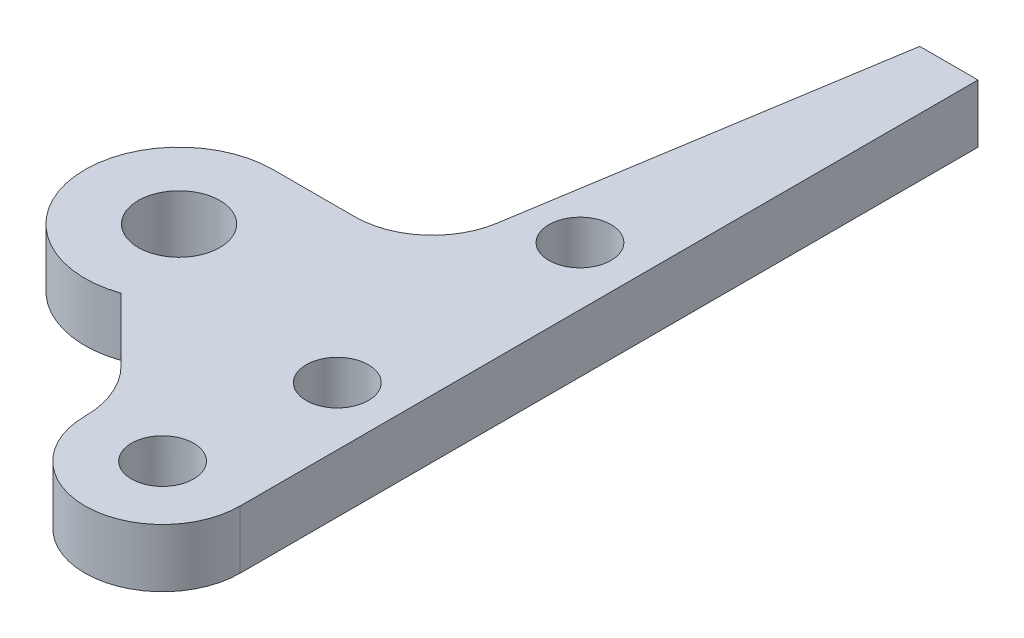
ISO-10303-21;
HEADER;
FILE_DESCRIPTION(('STEP AP214'),'2;1');
FILE_NAME('part.step','',(''),(''),'','','');
FILE_SCHEMA(('AUTOMOTIVE_DESIGN { 1 0 10303 214 1 1 1 1 }'));
ENDSEC;
DATA;
#1=APPLICATION_CONTEXT('core data for automotive mechanical design processes');
#2=APPLICATION_PROTOCOL_DEFINITION('international standard','automotive_design',2000,#1);
#3=PRODUCT_CONTEXT('',#1,'mechanical');
#4=PRODUCT('Part','Part','',(#3));
#5=PRODUCT_RELATED_PRODUCT_CATEGORY('part','',(#4));
#6=PRODUCT_DEFINITION_FORMATION('','',#4);
#7=PRODUCT_DEFINITION_CONTEXT('part definition',#1,'design');
#8=PRODUCT_DEFINITION('design','',#6,#7);
#9=PRODUCT_DEFINITION_SHAPE('','',#8);
#10=(LENGTH_UNIT() NAMED_UNIT(*) SI_UNIT(.MILLI.,.METRE.));
#11=(NAMED_UNIT(*) PLANE_ANGLE_UNIT() SI_UNIT($,.RADIAN.));
#12=(NAMED_UNIT(*) SI_UNIT($,.STERADIAN.) SOLID_ANGLE_UNIT());
#13=UNCERTAINTY_MEASURE_WITH_UNIT(LENGTH_MEASURE(1.E-05),#10,'distance_accuracy_value','');
#14=(GEOMETRIC_REPRESENTATION_CONTEXT(3) GLOBAL_UNCERTAINTY_ASSIGNED_CONTEXT((#13)) GLOBAL_UNIT_ASSIGNED_CONTEXT((#10,
#11,#12)) REPRESENTATION_CONTEXT('',''));
#15=CARTESIAN_POINT('',(0.,0.,0.));
#16=DIRECTION('',(0.,0.,1.));
#17=DIRECTION('',(1.,0.,0.));
#18=AXIS2_PLACEMENT_3D('',#15,#16,#17);
#19=CARTESIAN_POINT('',(0.,0.,0.));
#20=DIRECTION('',(0.,1.,0.));
#21=DIRECTION('',(1.,0.,0.));
#22=AXIS2_PLACEMENT_3D('',#19,#20,#21);
#23=PLANE('',#22);
#24=DIRECTION('',(-0.157736652180697,0.,0.98748121428148));
#25=VECTOR('',#24,1.);
#26=CARTESIAN_POINT('',(11.15,0.,-27.));
#27=LINE('',#26,#25);
#28=CARTESIAN_POINT('',(11.15,0.,-27.));
#29=VERTEX_POINT('',#28);
#30=CARTESIAN_POINT('',(8.15,0.,-8.219053391277));
#31=VERTEX_POINT('',#30);
#32=EDGE_CURVE('E111',#29,#31,#27,.T.);
#33=ORIENTED_EDGE('',*,*,#32,.F.);
#34=DIRECTION('',(-1.,0.,0.));
#35=VECTOR('',#34,1.);
#36=CARTESIAN_POINT('',(14.15,0.,-27.));
#37=LINE('',#36,#35);
#38=CARTESIAN_POINT('',(14.15,0.,-27.));
#39=VERTEX_POINT('',#38);
#40=EDGE_CURVE('E36',#39,#29,#37,.T.);
#41=ORIENTED_EDGE('',*,*,#40,.F.);
#42=DIRECTION('',(0.,0.,-1.));
#43=VECTOR('',#42,1.);
#44=CARTESIAN_POINT('',(14.15,0.,11.));
#45=LINE('',#44,#43);
#46=CARTESIAN_POINT('',(14.15,0.,11.));
#47=VERTEX_POINT('',#46);
#48=EDGE_CURVE('E125',#47,#39,#45,.T.);
#49=ORIENTED_EDGE('',*,*,#48,.F.);
#50=CARTESIAN_POINT('',(10.15,0.,11.));
#51=DIRECTION('',(0.,1.,0.));
#52=DIRECTION('',(-1.,0.,0.));
#53=AXIS2_PLACEMENT_3D('',#50,#51,#52);
#54=CIRCLE('',#53,4.);
#55=CARTESIAN_POINT('',(6.15,0.,11.));
#56=VERTEX_POINT('',#55);
#57=EDGE_CURVE('E129',#56,#47,#54,.T.);
#58=ORIENTED_EDGE('',*,*,#57,.F.);
#59=CARTESIAN_POINT('',(1.65,0.,11.));
#60=DIRECTION('',(0.,-1.,0.));
#61=DIRECTION('',(0.707106781186548,0.,-0.707106781186548));
#62=AXIS2_PLACEMENT_3D('',#59,#60,#61);
#63=CIRCLE('',#62,4.5);
#64=CARTESIAN_POINT('',(4.831980515339,0.,7.818019484661));
#65=VERTEX_POINT('',#64);
#66=EDGE_CURVE('E133',#65,#56,#63,.T.);
#67=ORIENTED_EDGE('',*,*,#66,.F.);
#68=DIRECTION('',(0.707106781186548,0.,0.707106781186548));
#69=VECTOR('',#68,1.);
#70=CARTESIAN_POINT('',(1.594397367406,0.,4.580436336727));
#71=LINE('',#70,#69);
#72=CARTESIAN_POINT('',(1.594397367406,0.,4.580436336727));
#73=VERTEX_POINT('',#72);
#74=EDGE_CURVE('E136',#73,#65,#71,.T.);
#75=ORIENTED_EDGE('',*,*,#74,.F.);
#76=CARTESIAN_POINT('',(0.,0.,0.));
#77=DIRECTION('',(0.,1.,0.));
#78=DIRECTION('',(0.,0.,-1.));
#79=AXIS2_PLACEMENT_3D('',#76,#77,#78);
#80=CIRCLE('',#79,4.85);
#81=CARTESIAN_POINT('',(0.,0.,-4.85));
#82=VERTEX_POINT('',#81);
#83=EDGE_CURVE('E139',#82,#73,#80,.T.);
#84=ORIENTED_EDGE('',*,*,#83,.F.);
#85=DIRECTION('',(-1.,0.,0.));
#86=VECTOR('',#85,1.);
#87=CARTESIAN_POINT('',(4.200075142874,0.,-4.85));
#88=LINE('',#87,#86);
#89=CARTESIAN_POINT('',(4.200075142874,0.,-4.85));
#90=VERTEX_POINT('',#89);
#91=EDGE_CURVE('E148',#90,#82,#88,.T.);
#92=ORIENTED_EDGE('',*,*,#91,.F.);
#93=CARTESIAN_POINT('',(4.200075142874,0.,-8.85));
#94=DIRECTION('',(0.,-1.,0.));
#95=DIRECTION('',(0.98748121428148,0.,0.157736652180697));
#96=AXIS2_PLACEMENT_3D('',#93,#94,#95);
#97=CIRCLE('',#96,4.);
#98=EDGE_CURVE('E113',#31,#90,#97,.T.);
#99=ORIENTED_EDGE('',*,*,#98,.F.);
#100=EDGE_LOOP('',(#33,#41,#49,#58,#67,#75,#84,#92,#99));
#101=FACE_BOUND('',#100,.T.);
#102=CARTESIAN_POINT('',(10.15,0.,11.));
#103=DIRECTION('',(0.,-1.,0.));
#104=DIRECTION('',(-1.,0.,0.));
#105=AXIS2_PLACEMENT_3D('',#102,#103,#104);
#106=CIRCLE('',#105,1.6);
#107=CARTESIAN_POINT('',(8.55,0.,11.));
#108=VERTEX_POINT('',#107);
#109=EDGE_CURVE('E27',#108,#108,#106,.T.);
#110=ORIENTED_EDGE('',*,*,#109,.F.);
#111=EDGE_LOOP('',(#110));
#112=FACE_BOUND('',#111,.T.);
#113=CARTESIAN_POINT('',(0.,0.,0.));
#114=DIRECTION('',(0.,1.,0.));
#115=DIRECTION('',(-1.,0.,0.));
#116=AXIS2_PLACEMENT_3D('',#113,#114,#115);
#117=CIRCLE('',#116,2.1);
#118=CARTESIAN_POINT('',(-2.1,0.,0.));
#119=VERTEX_POINT('',#118);
#120=EDGE_CURVE('E11',#119,#119,#117,.T.);
#121=ORIENTED_EDGE('',*,*,#120,.T.);
#122=EDGE_LOOP('',(#121));
#123=FACE_BOUND('',#122,.T.);
#124=CARTESIAN_POINT('',(11.15,0.,3.));
#125=DIRECTION('',(0.,-1.,0.));
#126=DIRECTION('',(-1.,0.,0.));
#127=AXIS2_PLACEMENT_3D('',#124,#125,#126);
#128=CIRCLE('',#127,1.6);
#129=CARTESIAN_POINT('',(9.55,0.,3.));
#130=VERTEX_POINT('',#129);
#131=EDGE_CURVE('E156',#130,#130,#128,.T.);
#132=ORIENTED_EDGE('',*,*,#131,.F.);
#133=EDGE_LOOP('',(#132));
#134=FACE_BOUND('',#133,.T.);
#135=CARTESIAN_POINT('',(11.15,0.,-9.5));
#136=DIRECTION('',(0.,-1.,0.));
#137=DIRECTION('',(-1.,0.,0.));
#138=AXIS2_PLACEMENT_3D('',#135,#136,#137);
#139=CIRCLE('',#138,1.6);
#140=CARTESIAN_POINT('',(9.55,0.,-9.5));
#141=VERTEX_POINT('',#140);
#142=EDGE_CURVE('E159',#141,#141,#139,.T.);
#143=ORIENTED_EDGE('',*,*,#142,.F.);
#144=EDGE_LOOP('',(#143));
#145=FACE_BOUND('',#144,.T.);
#146=ADVANCED_FACE('F17',(#101,#112,#123,#134,#145),#23,.F.);
#147=CARTESIAN_POINT('',(10.15,0.,11.));
#148=DIRECTION('',(0.,1.,0.));
#149=DIRECTION('',(1.,0.,0.));
#150=AXIS2_PLACEMENT_3D('',#147,#148,#149);
#151=CYLINDRICAL_SURFACE('',#150,1.6);
#152=CARTESIAN_POINT('',(10.15,3.,11.));
#153=DIRECTION('',(0.,-1.,0.));
#154=DIRECTION('',(1.,0.,0.));
#155=AXIS2_PLACEMENT_3D('',#152,#153,#154);
#156=CIRCLE('',#155,1.6);
#157=CARTESIAN_POINT('',(11.75,3.,11.));
#158=VERTEX_POINT('',#157);
#159=EDGE_CURVE('E103',#158,#158,#156,.T.);
#160=ORIENTED_EDGE('',*,*,#159,.F.);
#161=EDGE_LOOP('',(#160));
#162=FACE_BOUND('',#161,.T.);
#163=ORIENTED_EDGE('',*,*,#109,.T.);
#164=EDGE_LOOP('',(#163));
#165=FACE_BOUND('',#164,.T.);
#166=ADVANCED_FACE('F199',(#162,#165),#151,.F.);
#167=CARTESIAN_POINT('',(0.,3.,0.));
#168=DIRECTION('',(0.,1.,0.));
#169=DIRECTION('',(1.,0.,0.));
#170=AXIS2_PLACEMENT_3D('',#167,#168,#169);
#171=PLANE('',#170);
#172=DIRECTION('',(-1.,0.,0.));
#173=VECTOR('',#172,1.);
#174=CARTESIAN_POINT('',(4.200075142874,3.,-4.85));
#175=LINE('',#174,#173);
#176=CARTESIAN_POINT('',(4.200075142874,3.,-4.85));
#177=VERTEX_POINT('',#176);
#178=CARTESIAN_POINT('',(0.,3.,-4.85));
#179=VERTEX_POINT('',#178);
#180=EDGE_CURVE('E154',#177,#179,#175,.T.);
#181=ORIENTED_EDGE('',*,*,#180,.T.);
#182=CARTESIAN_POINT('',(0.,3.,0.));
#183=DIRECTION('',(0.,1.,0.));
#184=DIRECTION('',(0.,0.,-1.));
#185=AXIS2_PLACEMENT_3D('',#182,#183,#184);
#186=CIRCLE('',#185,4.85);
#187=CARTESIAN_POINT('',(1.594397367406,3.,4.580436336727));
#188=VERTEX_POINT('',#187);
#189=EDGE_CURVE('E166',#179,#188,#186,.T.);
#190=ORIENTED_EDGE('',*,*,#189,.T.);
#191=DIRECTION('',(0.707106781186548,0.,0.707106781186548));
#192=VECTOR('',#191,1.);
#193=CARTESIAN_POINT('',(1.594397367406,3.,4.580436336727));
#194=LINE('',#193,#192);
#195=CARTESIAN_POINT('',(4.831980515339,3.,7.818019484661));
#196=VERTEX_POINT('',#195);
#197=EDGE_CURVE('E169',#188,#196,#194,.T.);
#198=ORIENTED_EDGE('',*,*,#197,.T.);
#199=CARTESIAN_POINT('',(1.65,3.,11.));
#200=DIRECTION('',(0.,-1.,0.));
#201=DIRECTION('',(0.707106781186548,0.,-0.707106781186548));
#202=AXIS2_PLACEMENT_3D('',#199,#200,#201);
#203=CIRCLE('',#202,4.5);
#204=CARTESIAN_POINT('',(6.15,3.,11.));
#205=VERTEX_POINT('',#204);
#206=EDGE_CURVE('E172',#196,#205,#203,.T.);
#207=ORIENTED_EDGE('',*,*,#206,.T.);
#208=CARTESIAN_POINT('',(10.15,3.,11.));
#209=DIRECTION('',(0.,1.,0.));
#210=DIRECTION('',(-1.,0.,0.));
#211=AXIS2_PLACEMENT_3D('',#208,#209,#210);
#212=CIRCLE('',#211,4.);
#213=CARTESIAN_POINT('',(14.15,3.,11.));
#214=VERTEX_POINT('',#213);
#215=EDGE_CURVE('E175',#205,#214,#212,.T.);
#216=ORIENTED_EDGE('',*,*,#215,.T.);
#217=DIRECTION('',(0.,0.,-1.));
#218=VECTOR('',#217,1.);
#219=CARTESIAN_POINT('',(14.15,3.,11.));
#220=LINE('',#219,#218);
#221=CARTESIAN_POINT('',(14.15,3.,-27.));
#222=VERTEX_POINT('',#221);
#223=EDGE_CURVE('E178',#214,#222,#220,.T.);
#224=ORIENTED_EDGE('',*,*,#223,.T.);
#225=DIRECTION('',(-1.,0.,0.));
#226=VECTOR('',#225,1.);
#227=CARTESIAN_POINT('',(14.15,3.,-27.));
#228=LINE('',#227,#226);
#229=CARTESIAN_POINT('',(11.15,3.,-27.));
#230=VERTEX_POINT('',#229);
#231=EDGE_CURVE('E108',#222,#230,#228,.T.);
#232=ORIENTED_EDGE('',*,*,#231,.T.);
#233=DIRECTION('',(-0.157736652180697,0.,0.98748121428148));
#234=VECTOR('',#233,1.);
#235=CARTESIAN_POINT('',(11.15,3.,-27.));
#236=LINE('',#235,#234);
#237=CARTESIAN_POINT('',(8.15,3.,-8.219053391277));
#238=VERTEX_POINT('',#237);
#239=EDGE_CURVE('E88',#230,#238,#236,.T.);
#240=ORIENTED_EDGE('',*,*,#239,.T.);
#241=CARTESIAN_POINT('',(4.200075142874,3.,-8.85));
#242=DIRECTION('',(0.,-1.,0.));
#243=DIRECTION('',(0.98748121428148,0.,0.157736652180697));
#244=AXIS2_PLACEMENT_3D('',#241,#242,#243);
#245=CIRCLE('',#244,4.);
#246=EDGE_CURVE('E94',#238,#177,#245,.T.);
#247=ORIENTED_EDGE('',*,*,#246,.T.);
#248=EDGE_LOOP('',(#181,#190,#198,#207,#216,#224,#232,#240,#247));
#249=FACE_BOUND('',#248,.T.);
#250=ORIENTED_EDGE('',*,*,#159,.T.);
#251=EDGE_LOOP('',(#250));
#252=FACE_BOUND('',#251,.T.);
#253=CARTESIAN_POINT('',(0.,3.,0.));
#254=DIRECTION('',(0.,1.,0.));
#255=DIRECTION('',(-1.,0.,0.));
#256=AXIS2_PLACEMENT_3D('',#253,#254,#255);
#257=CIRCLE('',#256,2.1);
#258=CARTESIAN_POINT('',(-2.1,3.,0.));
#259=VERTEX_POINT('',#258);
#260=EDGE_CURVE('E151',#259,#259,#257,.T.);
#261=ORIENTED_EDGE('',*,*,#260,.F.);
#262=EDGE_LOOP('',(#261));
#263=FACE_BOUND('',#262,.T.);
#264=CARTESIAN_POINT('',(11.15,3.,3.));
#265=DIRECTION('',(0.,-1.,0.));
#266=DIRECTION('',(-1.,0.,0.));
#267=AXIS2_PLACEMENT_3D('',#264,#265,#266);
#268=CIRCLE('',#267,1.6);
#269=CARTESIAN_POINT('',(9.55,3.,3.));
#270=VERTEX_POINT('',#269);
#271=EDGE_CURVE('E164',#270,#270,#268,.T.);
#272=ORIENTED_EDGE('',*,*,#271,.T.);
#273=EDGE_LOOP('',(#272));
#274=FACE_BOUND('',#273,.T.);
#275=CARTESIAN_POINT('',(11.15,3.,-9.5));
#276=DIRECTION('',(0.,-1.,0.));
#277=DIRECTION('',(-1.,0.,0.));
#278=AXIS2_PLACEMENT_3D('',#275,#276,#277);
#279=CIRCLE('',#278,1.6);
#280=CARTESIAN_POINT('',(9.55,3.,-9.5));
#281=VERTEX_POINT('',#280);
#282=EDGE_CURVE('E184',#281,#281,#279,.T.);
#283=ORIENTED_EDGE('',*,*,#282,.T.);
#284=EDGE_LOOP('',(#283));
#285=FACE_BOUND('',#284,.T.);
#286=ADVANCED_FACE('F105',(#249,#252,#263,#274,#285),#171,.T.);
#287=CARTESIAN_POINT('',(4.200075142874,0.,-8.85));
#288=DIRECTION('',(0.,1.,0.));
#289=DIRECTION('',(1.,0.,0.));
#290=AXIS2_PLACEMENT_3D('',#287,#288,#289);
#291=CYLINDRICAL_SURFACE('',#290,4.);
#292=DIRECTION('',(0.,1.,0.));
#293=VECTOR('',#292,1.);
#294=CARTESIAN_POINT('',(4.200075142874,0.,-4.85));
#295=LINE('',#294,#293);
#296=EDGE_CURVE('E99',#90,#177,#295,.T.);
#297=ORIENTED_EDGE('',*,*,#296,.T.);
#298=ORIENTED_EDGE('',*,*,#246,.F.);
#299=DIRECTION('',(0.,1.,0.));
#300=VECTOR('',#299,1.);
#301=CARTESIAN_POINT('',(8.15,0.,-8.219053391277));
#302=LINE('',#301,#300);
#303=EDGE_CURVE('E97',#31,#238,#302,.T.);
#304=ORIENTED_EDGE('',*,*,#303,.F.);
#305=ORIENTED_EDGE('',*,*,#98,.T.);
#306=EDGE_LOOP('',(#297,#298,#304,#305));
#307=FACE_BOUND('',#306,.T.);
#308=ADVANCED_FACE('F95',(#307),#291,.F.);
#309=CARTESIAN_POINT('',(11.15,0.,-27.));
#310=DIRECTION('',(-0.98748121428148,0.,-0.157736652180697));
#311=DIRECTION('',(-0.157736652180697,0.,0.98748121428148));
#312=AXIS2_PLACEMENT_3D('',#309,#310,#311);
#313=PLANE('',#312);
#314=ORIENTED_EDGE('',*,*,#303,.T.);
#315=ORIENTED_EDGE('',*,*,#239,.F.);
#316=DIRECTION('',(0.,1.,0.));
#317=VECTOR('',#316,1.);
#318=CARTESIAN_POINT('',(11.15,0.,-27.));
#319=LINE('',#318,#317);
#320=EDGE_CURVE('E116',#29,#230,#319,.T.);
#321=ORIENTED_EDGE('',*,*,#320,.F.);
#322=ORIENTED_EDGE('',*,*,#32,.T.);
#323=EDGE_LOOP('',(#314,#315,#321,#322));
#324=FACE_BOUND('',#323,.T.);
#325=ADVANCED_FACE('F110',(#324),#313,.T.);
#326=CARTESIAN_POINT('',(14.15,0.,-27.));
#327=DIRECTION('',(0.,0.,-1.));
#328=DIRECTION('',(-1.,0.,0.));
#329=AXIS2_PLACEMENT_3D('',#326,#327,#328);
#330=PLANE('',#329);
#331=ORIENTED_EDGE('',*,*,#320,.T.);
#332=ORIENTED_EDGE('',*,*,#231,.F.);
#333=DIRECTION('',(0.,1.,0.));
#334=VECTOR('',#333,1.);
#335=CARTESIAN_POINT('',(14.15,0.,-27.));
#336=LINE('',#335,#334);
#337=EDGE_CURVE('E122',#39,#222,#336,.T.);
#338=ORIENTED_EDGE('',*,*,#337,.F.);
#339=ORIENTED_EDGE('',*,*,#40,.T.);
#340=EDGE_LOOP('',(#331,#332,#338,#339));
#341=FACE_BOUND('',#340,.T.);
#342=ADVANCED_FACE('F215',(#341),#330,.T.);
#343=CARTESIAN_POINT('',(14.15,0.,11.));
#344=DIRECTION('',(1.,0.,0.));
#345=DIRECTION('',(0.,0.,-1.));
#346=AXIS2_PLACEMENT_3D('',#343,#344,#345);
#347=PLANE('',#346);
#348=ORIENTED_EDGE('',*,*,#337,.T.);
#349=ORIENTED_EDGE('',*,*,#223,.F.);
#350=DIRECTION('',(0.,1.,0.));
#351=VECTOR('',#350,1.);
#352=CARTESIAN_POINT('',(14.15,0.,11.));
#353=LINE('',#352,#351);
#354=EDGE_CURVE('E126',#47,#214,#353,.T.);
#355=ORIENTED_EDGE('',*,*,#354,.F.);
#356=ORIENTED_EDGE('',*,*,#48,.T.);
#357=EDGE_LOOP('',(#348,#349,#355,#356));
#358=FACE_BOUND('',#357,.T.);
#359=ADVANCED_FACE('F218',(#358),#347,.T.);
#360=CARTESIAN_POINT('',(10.15,0.,11.));
#361=DIRECTION('',(0.,1.,0.));
#362=DIRECTION('',(1.,0.,0.));
#363=AXIS2_PLACEMENT_3D('',#360,#361,#362);
#364=CYLINDRICAL_SURFACE('',#363,4.);
#365=ORIENTED_EDGE('',*,*,#354,.T.);
#366=ORIENTED_EDGE('',*,*,#215,.F.);
#367=DIRECTION('',(0.,1.,0.));
#368=VECTOR('',#367,1.);
#369=CARTESIAN_POINT('',(6.15,0.,11.));
#370=LINE('',#369,#368);
#371=EDGE_CURVE('E130',#56,#205,#370,.T.);
#372=ORIENTED_EDGE('',*,*,#371,.F.);
#373=ORIENTED_EDGE('',*,*,#57,.T.);
#374=EDGE_LOOP('',(#365,#366,#372,#373));
#375=FACE_BOUND('',#374,.T.);
#376=ADVANCED_FACE('F221',(#375),#364,.T.);
#377=CARTESIAN_POINT('',(1.65,0.,11.));
#378=DIRECTION('',(0.,1.,0.));
#379=DIRECTION('',(1.,0.,0.));
#380=AXIS2_PLACEMENT_3D('',#377,#378,#379);
#381=CYLINDRICAL_SURFACE('',#380,4.5);
#382=ORIENTED_EDGE('',*,*,#371,.T.);
#383=ORIENTED_EDGE('',*,*,#206,.F.);
#384=DIRECTION('',(0.,1.,0.));
#385=VECTOR('',#384,1.);
#386=CARTESIAN_POINT('',(4.831980515339,0.,7.818019484661));
#387=LINE('',#386,#385);
#388=EDGE_CURVE('E134',#65,#196,#387,.T.);
#389=ORIENTED_EDGE('',*,*,#388,.F.);
#390=ORIENTED_EDGE('',*,*,#66,.T.);
#391=EDGE_LOOP('',(#382,#383,#389,#390));
#392=FACE_BOUND('',#391,.T.);
#393=ADVANCED_FACE('F225',(#392),#381,.F.);
#394=CARTESIAN_POINT('',(1.594397367406,0.,4.580436336727));
#395=DIRECTION('',(-0.707106781186548,0.,0.707106781186548));
#396=DIRECTION('',(0.707106781186548,0.,0.707106781186548));
#397=AXIS2_PLACEMENT_3D('',#394,#395,#396);
#398=PLANE('',#397);
#399=ORIENTED_EDGE('',*,*,#388,.T.);
#400=ORIENTED_EDGE('',*,*,#197,.F.);
#401=DIRECTION('',(0.,1.,0.));
#402=VECTOR('',#401,1.);
#403=CARTESIAN_POINT('',(1.594397367406,0.,4.580436336727));
#404=LINE('',#403,#402);
#405=EDGE_CURVE('E137',#73,#188,#404,.T.);
#406=ORIENTED_EDGE('',*,*,#405,.F.);
#407=ORIENTED_EDGE('',*,*,#74,.T.);
#408=EDGE_LOOP('',(#399,#400,#406,#407));
#409=FACE_BOUND('',#408,.T.);
#410=ADVANCED_FACE('F229',(#409),#398,.T.);
#411=CARTESIAN_POINT('',(0.,0.,0.));
#412=DIRECTION('',(0.,1.,0.));
#413=DIRECTION('',(1.,0.,0.));
#414=AXIS2_PLACEMENT_3D('',#411,#412,#413);
#415=CYLINDRICAL_SURFACE('',#414,4.85);
#416=ORIENTED_EDGE('',*,*,#405,.T.);
#417=ORIENTED_EDGE('',*,*,#189,.F.);
#418=DIRECTION('',(0.,1.,0.));
#419=VECTOR('',#418,1.);
#420=CARTESIAN_POINT('',(0.,0.,-4.85));
#421=LINE('',#420,#419);
#422=EDGE_CURVE('E21',#82,#179,#421,.T.);
#423=ORIENTED_EDGE('',*,*,#422,.F.);
#424=ORIENTED_EDGE('',*,*,#83,.T.);
#425=EDGE_LOOP('',(#416,#417,#423,#424));
#426=FACE_BOUND('',#425,.T.);
#427=ADVANCED_FACE('F233',(#426),#415,.T.);
#428=CARTESIAN_POINT('',(4.200075142874,0.,-4.85));
#429=DIRECTION('',(0.,0.,-1.));
#430=DIRECTION('',(-1.,0.,0.));
#431=AXIS2_PLACEMENT_3D('',#428,#429,#430);
#432=PLANE('',#431);
#433=ORIENTED_EDGE('',*,*,#422,.T.);
#434=ORIENTED_EDGE('',*,*,#180,.F.);
#435=ORIENTED_EDGE('',*,*,#296,.F.);
#436=ORIENTED_EDGE('',*,*,#91,.T.);
#437=EDGE_LOOP('',(#433,#434,#435,#436));
#438=FACE_BOUND('',#437,.T.);
#439=ADVANCED_FACE('F237',(#438),#432,.T.);
#440=CARTESIAN_POINT('',(0.,-0.4485,0.));
#441=DIRECTION('',(0.,1.,0.));
#442=DIRECTION('',(1.,0.,0.));
#443=AXIS2_PLACEMENT_3D('',#440,#441,#442);
#444=CYLINDRICAL_SURFACE('',#443,2.1);
#445=ORIENTED_EDGE('',*,*,#260,.T.);
#446=EDGE_LOOP('',(#445));
#447=FACE_BOUND('',#446,.T.);
#448=ORIENTED_EDGE('',*,*,#120,.F.);
#449=EDGE_LOOP('',(#448));
#450=FACE_BOUND('',#449,.T.);
#451=ADVANCED_FACE('F196',(#447,#450),#444,.F.);
#452=CARTESIAN_POINT('',(11.15,3.,3.));
#453=DIRECTION('',(0.,-1.,0.));
#454=DIRECTION('',(1.,0.,0.));
#455=AXIS2_PLACEMENT_3D('',#452,#453,#454);
#456=CYLINDRICAL_SURFACE('',#455,1.6);
#457=ORIENTED_EDGE('',*,*,#131,.T.);
#458=EDGE_LOOP('',(#457));
#459=FACE_BOUND('',#458,.T.);
#460=ORIENTED_EDGE('',*,*,#271,.F.);
#461=EDGE_LOOP('',(#460));
#462=FACE_BOUND('',#461,.T.);
#463=ADVANCED_FACE('F190',(#459,#462),#456,.F.);
#464=CARTESIAN_POINT('',(11.15,3.,-9.5));
#465=DIRECTION('',(0.,-1.,0.));
#466=DIRECTION('',(1.,0.,0.));
#467=AXIS2_PLACEMENT_3D('',#464,#465,#466);
#468=CYLINDRICAL_SURFACE('',#467,1.6);
#469=ORIENTED_EDGE('',*,*,#142,.T.);
#470=EDGE_LOOP('',(#469));
#471=FACE_BOUND('',#470,.T.);
#472=ORIENTED_EDGE('',*,*,#282,.F.);
#473=EDGE_LOOP('',(#472));
#474=FACE_BOUND('',#473,.T.);
#475=ADVANCED_FACE('F19',(#471,#474),#468,.F.);
#476=CLOSED_SHELL('',(#146,#166,#286,#308,#325,#342,#359,#376,#393,#410,#427,#439,#451,#463,#475));
#477=MANIFOLD_SOLID_BREP('B1',#476);
#478=ADVANCED_BREP_SHAPE_REPRESENTATION('',(#18,#477),#14);
#479=SHAPE_DEFINITION_REPRESENTATION(#9,#478);
ENDSEC;
END-ISO-10303-21;
